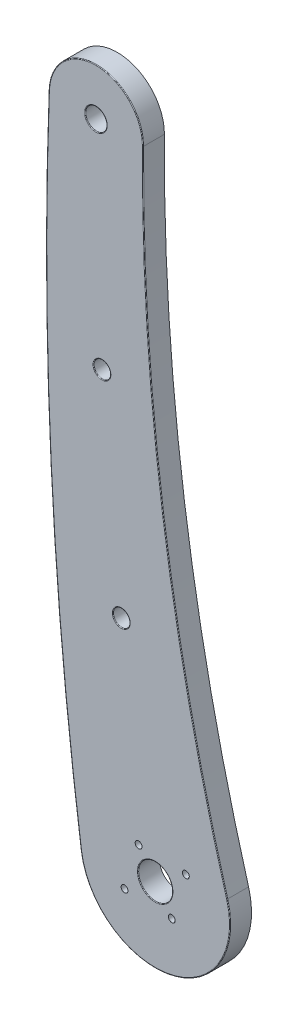
ISO-10303-21;
HEADER;
FILE_DESCRIPTION(('STEP AP214'),'2;1');
FILE_NAME('part.step','',(''),(''),'','','');
FILE_SCHEMA(('AUTOMOTIVE_DESIGN { 1 0 10303 214 1 1 1 1 }'));
ENDSEC;
DATA;
#1=APPLICATION_CONTEXT('core data for automotive mechanical design processes');
#2=APPLICATION_PROTOCOL_DEFINITION('international standard','automotive_design',2000,#1);
#3=PRODUCT_CONTEXT('',#1,'mechanical');
#4=PRODUCT('Part','Part','',(#3));
#5=PRODUCT_RELATED_PRODUCT_CATEGORY('part','',(#4));
#6=PRODUCT_DEFINITION_FORMATION('','',#4);
#7=PRODUCT_DEFINITION_CONTEXT('part definition',#1,'design');
#8=PRODUCT_DEFINITION('design','',#6,#7);
#9=PRODUCT_DEFINITION_SHAPE('','',#8);
#10=(LENGTH_UNIT() NAMED_UNIT(*) SI_UNIT(.MILLI.,.METRE.));
#11=(NAMED_UNIT(*) PLANE_ANGLE_UNIT() SI_UNIT($,.RADIAN.));
#12=(NAMED_UNIT(*) SI_UNIT($,.STERADIAN.) SOLID_ANGLE_UNIT());
#13=UNCERTAINTY_MEASURE_WITH_UNIT(LENGTH_MEASURE(1.E-05),#10,'distance_accuracy_value','');
#14=(GEOMETRIC_REPRESENTATION_CONTEXT(3) GLOBAL_UNCERTAINTY_ASSIGNED_CONTEXT((#13)) GLOBAL_UNIT_ASSIGNED_CONTEXT((#10,
#11,#12)) REPRESENTATION_CONTEXT('',''));
#15=CARTESIAN_POINT('',(0.,0.,0.));
#16=DIRECTION('',(0.,0.,1.));
#17=DIRECTION('',(1.,0.,0.));
#18=AXIS2_PLACEMENT_3D('',#15,#16,#17);
#19=CARTESIAN_POINT('',(-34.070033869126,204.93052277418,-5.));
#20=DIRECTION('',(0.,0.,1.));
#21=DIRECTION('',(1.,0.,0.));
#22=AXIS2_PLACEMENT_3D('',#19,#20,#21);
#23=CYLINDRICAL_SURFACE('',#22,11.0000000000001);
#24=DIRECTION('',(0.,0.,1.));
#25=VECTOR('',#24,1.);
#26=CARTESIAN_POINT('',(-45.0618330985259,205.355198768986,-5.));
#27=LINE('',#26,#25);
#28=CARTESIAN_POINT('',(-45.0618330985259,205.355198768986,-5.));
#29=VERTEX_POINT('',#28);
#30=CARTESIAN_POINT('',(-45.0618330985259,205.355198768986,-0.15));
#31=VERTEX_POINT('',#30);
#32=EDGE_CURVE('E87',#29,#31,#27,.T.);
#33=ORIENTED_EDGE('',*,*,#32,.T.);
#34=CARTESIAN_POINT('',(-34.070033869126,204.93052277418,-0.15));
#35=DIRECTION('',(0.,0.,-1.));
#36=DIRECTION('',(-1.,0.,0.));
#37=AXIS2_PLACEMENT_3D('',#34,#35,#36);
#38=CIRCLE('',#37,11.0000000000001);
#39=CARTESIAN_POINT('',(-23.0703086252271,204.852776013868,-0.15));
#40=VERTEX_POINT('',#39);
#41=EDGE_CURVE('E148',#31,#40,#38,.T.);
#42=ORIENTED_EDGE('',*,*,#41,.T.);
#43=DIRECTION('',(0.,0.,1.));
#44=VECTOR('',#43,1.);
#45=CARTESIAN_POINT('',(-23.0703086252271,204.852776013868,-5.));
#46=LINE('',#45,#44);
#47=CARTESIAN_POINT('',(-23.0703086252271,204.852776013868,-5.));
#48=VERTEX_POINT('',#47);
#49=EDGE_CURVE('E108',#48,#40,#46,.T.);
#50=ORIENTED_EDGE('',*,*,#49,.F.);
#51=CARTESIAN_POINT('',(-34.070033869126,204.93052277418,-5.));
#52=DIRECTION('',(0.,0.,1.));
#53=DIRECTION('',(-1.,0.,0.));
#54=AXIS2_PLACEMENT_3D('',#51,#52,#53);
#55=CIRCLE('',#54,11.0000000000001);
#56=EDGE_CURVE('E102',#48,#29,#55,.T.);
#57=ORIENTED_EDGE('',*,*,#56,.T.);
#58=EDGE_LOOP('',(#33,#42,#50,#57));
#59=FACE_BOUND('',#58,.T.);
#60=ADVANCED_FACE('F33',(#59),#23,.T.);
#61=CARTESIAN_POINT('',(476.917202461075,201.31883236334,-5.));
#62=DIRECTION('',(0.,0.,1.));
#63=DIRECTION('',(1.,0.,0.));
#64=AXIS2_PLACEMENT_3D('',#61,#62,#63);
#65=CYLINDRICAL_SURFACE('',#64,500.);
#66=ORIENTED_EDGE('',*,*,#49,.T.);
#67=CARTESIAN_POINT('',(476.917202461075,201.31883236334,-0.15));
#68=DIRECTION('',(0.,0.,-1.));
#69=DIRECTION('',(-1.,0.,0.));
#70=AXIS2_PLACEMENT_3D('',#67,#68,#69);
#71=CIRCLE('',#70,500.);
#72=CARTESIAN_POINT('',(-3.40859701822455,62.4407334615624,-0.15));
#73=VERTEX_POINT('',#72);
#74=EDGE_CURVE('E143',#40,#73,#71,.F.);
#75=ORIENTED_EDGE('',*,*,#74,.T.);
#76=DIRECTION('',(0.,0.,1.));
#77=VECTOR('',#76,1.);
#78=CARTESIAN_POINT('',(-3.40859701822455,62.4407334615624,-5.));
#79=LINE('',#78,#77);
#80=CARTESIAN_POINT('',(-3.40859701822455,62.4407334615624,-5.));
#81=VERTEX_POINT('',#80);
#82=EDGE_CURVE('E120',#81,#73,#79,.T.);
#83=ORIENTED_EDGE('',*,*,#82,.F.);
#84=CARTESIAN_POINT('',(476.917202461075,201.31883236334,-5.));
#85=DIRECTION('',(0.,0.,-1.));
#86=DIRECTION('',(1.,0.,0.));
#87=AXIS2_PLACEMENT_3D('',#84,#85,#86);
#88=CIRCLE('',#87,500.);
#89=EDGE_CURVE('E95',#81,#48,#88,.T.);
#90=ORIENTED_EDGE('',*,*,#89,.T.);
#91=EDGE_LOOP('',(#66,#75,#83,#90));
#92=FACE_BOUND('',#91,.T.);
#93=ADVANCED_FACE('F204',(#92),#65,.F.);
#94=CARTESIAN_POINT('',(-20.2200000000003,57.58,-5.));
#95=DIRECTION('',(0.,0.,1.));
#96=DIRECTION('',(1.,0.,0.));
#97=AXIS2_PLACEMENT_3D('',#94,#95,#96);
#98=CYLINDRICAL_SURFACE('',#97,17.5);
#99=ORIENTED_EDGE('',*,*,#82,.T.);
#100=CARTESIAN_POINT('',(-20.2200000000003,57.58,-0.15));
#101=DIRECTION('',(0.,0.,-1.));
#102=DIRECTION('',(-1.,0.,0.));
#103=AXIS2_PLACEMENT_3D('',#100,#101,#102);
#104=CIRCLE('',#103,17.5);
#105=CARTESIAN_POINT('',(-37.552346237058,55.1634375822777,-0.15));
#106=VERTEX_POINT('',#105);
#107=EDGE_CURVE('E58',#73,#106,#104,.T.);
#108=ORIENTED_EDGE('',*,*,#107,.T.);
#109=DIRECTION('',(0.,0.,1.));
#110=VECTOR('',#109,1.);
#111=CARTESIAN_POINT('',(-37.552346237058,55.1634375822777,-5.));
#112=LINE('',#111,#110);
#113=CARTESIAN_POINT('',(-37.552346237058,55.1634375822777,-5.));
#114=VERTEX_POINT('',#113);
#115=EDGE_CURVE('E94',#114,#106,#112,.T.);
#116=ORIENTED_EDGE('',*,*,#115,.F.);
#117=CARTESIAN_POINT('',(-20.2200000000003,57.58,-5.));
#118=DIRECTION('',(0.,0.,1.));
#119=DIRECTION('',(-1.,0.,0.));
#120=AXIS2_PLACEMENT_3D('',#117,#118,#119);
#121=CIRCLE('',#120,17.5);
#122=EDGE_CURVE('E105',#114,#81,#121,.T.);
#123=ORIENTED_EDGE('',*,*,#122,.T.);
#124=EDGE_LOOP('',(#99,#108,#116,#123));
#125=FACE_BOUND('',#124,.T.);
#126=ADVANCED_FACE('F209',(#125),#98,.T.);
#127=CARTESIAN_POINT('',(804.304470991464,172.539326443077,-5.));
#128=DIRECTION('',(0.,0.,1.));
#129=DIRECTION('',(1.,0.,0.));
#130=AXIS2_PLACEMENT_3D('',#127,#128,#129);
#131=CYLINDRICAL_SURFACE('',#130,850.);
#132=ORIENTED_EDGE('',*,*,#115,.T.);
#133=CARTESIAN_POINT('',(804.304470991464,172.539326443077,-0.15));
#134=DIRECTION('',(0.,0.,-1.));
#135=DIRECTION('',(-1.,0.,0.));
#136=AXIS2_PLACEMENT_3D('',#133,#134,#135);
#137=CIRCLE('',#136,850.);
#138=EDGE_CURVE('E50',#106,#31,#137,.T.);
#139=ORIENTED_EDGE('',*,*,#138,.T.);
#140=ORIENTED_EDGE('',*,*,#32,.F.);
#141=CARTESIAN_POINT('',(804.304470991464,172.539326443077,-5.));
#142=DIRECTION('',(0.,0.,1.));
#143=DIRECTION('',(1.,0.,0.));
#144=AXIS2_PLACEMENT_3D('',#141,#142,#143);
#145=CIRCLE('',#144,850.);
#146=EDGE_CURVE('E90',#29,#114,#145,.T.);
#147=ORIENTED_EDGE('',*,*,#146,.T.);
#148=EDGE_LOOP('',(#132,#139,#140,#147));
#149=FACE_BOUND('',#148,.T.);
#150=ADVANCED_FACE('F89',(#149),#131,.T.);
#151=CARTESIAN_POINT('',(221.423584295974,203.12467756876,-5.));
#152=DIRECTION('',(0.,0.,-1.));
#153=DIRECTION('',(-1.,0.,0.));
#154=AXIS2_PLACEMENT_3D('',#151,#152,#153);
#155=PLANE('',#154);
#156=CARTESIAN_POINT('',(-24.0961215210223,63.1061362591118,-5.));
#157=DIRECTION('',(0.,0.,1.));
#158=DIRECTION('',(1.,0.,0.));
#159=AXIS2_PLACEMENT_3D('',#156,#157,#158);
#160=CIRCLE('',#159,0.799999999999994);
#161=CARTESIAN_POINT('',(-23.2961215210223,63.1061362591118,-5.));
#162=VERTEX_POINT('',#161);
#163=EDGE_CURVE('E303',#162,#162,#160,.T.);
#164=ORIENTED_EDGE('',*,*,#163,.T.);
#165=EDGE_LOOP('',(#164));
#166=FACE_BOUND('',#165,.T.);
#167=CARTESIAN_POINT('',(-13.056490034485,62.6046019716953,-5.));
#168=DIRECTION('',(0.,0.,1.));
#169=DIRECTION('',(1.,0.,0.));
#170=AXIS2_PLACEMENT_3D('',#167,#168,#169);
#171=CIRCLE('',#170,0.800000000000004);
#172=CARTESIAN_POINT('',(-12.256490034485,62.6046019716953,-5.));
#173=VERTEX_POINT('',#172);
#174=EDGE_CURVE('E311',#173,#173,#171,.T.);
#175=ORIENTED_EDGE('',*,*,#174,.T.);
#176=EDGE_LOOP('',(#175));
#177=FACE_BOUND('',#176,.T.);
#178=CARTESIAN_POINT('',(-16.3438784789781,52.0538637408883,-5.));
#179=DIRECTION('',(0.,0.,1.));
#180=DIRECTION('',(1.,0.,0.));
#181=AXIS2_PLACEMENT_3D('',#178,#179,#180);
#182=CIRCLE('',#181,0.800000000000005);
#183=CARTESIAN_POINT('',(-15.5438784789781,52.0538637408883,-5.));
#184=VERTEX_POINT('',#183);
#185=EDGE_CURVE('E317',#184,#184,#182,.T.);
#186=ORIENTED_EDGE('',*,*,#185,.T.);
#187=EDGE_LOOP('',(#186));
#188=FACE_BOUND('',#187,.T.);
#189=CARTESIAN_POINT('',(-27.3835099655154,52.5553980283048,-5.));
#190=DIRECTION('',(0.,0.,1.));
#191=DIRECTION('',(1.,0.,0.));
#192=AXIS2_PLACEMENT_3D('',#189,#190,#191);
#193=CIRCLE('',#192,0.8);
#194=CARTESIAN_POINT('',(-26.5835099655154,52.5553980283048,-5.));
#195=VERTEX_POINT('',#194);
#196=EDGE_CURVE('E161',#195,#195,#193,.T.);
#197=ORIENTED_EDGE('',*,*,#196,.T.);
#198=EDGE_LOOP('',(#197));
#199=FACE_BOUND('',#198,.T.);
#200=CARTESIAN_POINT('',(-32.6586969077332,154.950445463501,-5.));
#201=DIRECTION('',(0.,0.,-1.));
#202=DIRECTION('',(-1.,0.,0.));
#203=AXIS2_PLACEMENT_3D('',#200,#201,#202);
#204=CIRCLE('',#203,1.94999999999999);
#205=CARTESIAN_POINT('',(-34.6086969077332,154.950445463501,-5.));
#206=VERTEX_POINT('',#205);
#207=EDGE_CURVE('E168',#206,#206,#204,.T.);
#208=ORIENTED_EDGE('',*,*,#207,.F.);
#209=EDGE_LOOP('',(#208));
#210=FACE_BOUND('',#209,.T.);
#211=CARTESIAN_POINT('',(-28.1467342258711,106.947670438379,-5.));
#212=DIRECTION('',(0.,0.,-1.));
#213=DIRECTION('',(-1.,0.,0.));
#214=AXIS2_PLACEMENT_3D('',#211,#212,#213);
#215=CIRCLE('',#214,1.94999999999999);
#216=CARTESIAN_POINT('',(-30.0967342258711,106.947670438379,-5.));
#217=VERTEX_POINT('',#216);
#218=EDGE_CURVE('E173',#217,#217,#215,.T.);
#219=ORIENTED_EDGE('',*,*,#218,.F.);
#220=EDGE_LOOP('',(#219));
#221=FACE_BOUND('',#220,.T.);
#222=CARTESIAN_POINT('',(-20.22,57.58,-5.));
#223=DIRECTION('',(0.,0.,1.));
#224=DIRECTION('',(1.,0.,0.));
#225=AXIS2_PLACEMENT_3D('',#222,#223,#224);
#226=CIRCLE('',#225,4.);
#227=CARTESIAN_POINT('',(-16.22,57.58,-5.));
#228=VERTEX_POINT('',#227);
#229=EDGE_CURVE('E112',#228,#228,#226,.T.);
#230=ORIENTED_EDGE('',*,*,#229,.T.);
#231=EDGE_LOOP('',(#230));
#232=FACE_BOUND('',#231,.T.);
#233=CARTESIAN_POINT('',(-34.0700338691259,204.93052277418,-5.));
#234=DIRECTION('',(0.,0.,1.));
#235=DIRECTION('',(1.,0.,0.));
#236=AXIS2_PLACEMENT_3D('',#233,#234,#235);
#237=CIRCLE('',#236,2.5);
#238=CARTESIAN_POINT('',(-31.5700338691259,204.93052277418,-5.));
#239=VERTEX_POINT('',#238);
#240=EDGE_CURVE('E109',#239,#239,#237,.T.);
#241=ORIENTED_EDGE('',*,*,#240,.T.);
#242=EDGE_LOOP('',(#241));
#243=FACE_BOUND('',#242,.T.);
#244=ORIENTED_EDGE('',*,*,#56,.F.);
#245=ORIENTED_EDGE('',*,*,#89,.F.);
#246=ORIENTED_EDGE('',*,*,#122,.F.);
#247=ORIENTED_EDGE('',*,*,#146,.F.);
#248=EDGE_LOOP('',(#244,#245,#246,#247));
#249=FACE_BOUND('',#248,.T.);
#250=ADVANCED_FACE('F100',(#166,#177,#188,#199,#210,#221,#232,#243,#249),#155,.T.);
#251=CARTESIAN_POINT('',(221.423584295974,203.12467756876,0.));
#252=DIRECTION('',(0.,0.,-1.));
#253=DIRECTION('',(-1.,0.,0.));
#254=AXIS2_PLACEMENT_3D('',#251,#252,#253);
#255=PLANE('',#254);
#256=CARTESIAN_POINT('',(-24.0961215210223,63.1061362591118,0.));
#257=DIRECTION('',(0.,0.,1.));
#258=DIRECTION('',(1.,0.,0.));
#259=AXIS2_PLACEMENT_3D('',#256,#257,#258);
#260=CIRCLE('',#259,0.799999999999994);
#261=CARTESIAN_POINT('',(-23.2961215210223,63.1061362591118,0.));
#262=VERTEX_POINT('',#261);
#263=EDGE_CURVE('E306',#262,#262,#260,.T.);
#264=ORIENTED_EDGE('',*,*,#263,.F.);
#265=EDGE_LOOP('',(#264));
#266=FACE_BOUND('',#265,.T.);
#267=CARTESIAN_POINT('',(-13.056490034485,62.6046019716953,0.));
#268=DIRECTION('',(0.,0.,1.));
#269=DIRECTION('',(1.,0.,0.));
#270=AXIS2_PLACEMENT_3D('',#267,#268,#269);
#271=CIRCLE('',#270,0.800000000000004);
#272=CARTESIAN_POINT('',(-12.256490034485,62.6046019716953,0.));
#273=VERTEX_POINT('',#272);
#274=EDGE_CURVE('E308',#273,#273,#271,.T.);
#275=ORIENTED_EDGE('',*,*,#274,.F.);
#276=EDGE_LOOP('',(#275));
#277=FACE_BOUND('',#276,.T.);
#278=CARTESIAN_POINT('',(-16.3438784789781,52.0538637408883,0.));
#279=DIRECTION('',(0.,0.,1.));
#280=DIRECTION('',(1.,0.,0.));
#281=AXIS2_PLACEMENT_3D('',#278,#279,#280);
#282=CIRCLE('',#281,0.800000000000005);
#283=CARTESIAN_POINT('',(-15.5438784789781,52.0538637408883,0.));
#284=VERTEX_POINT('',#283);
#285=EDGE_CURVE('E314',#284,#284,#282,.T.);
#286=ORIENTED_EDGE('',*,*,#285,.F.);
#287=EDGE_LOOP('',(#286));
#288=FACE_BOUND('',#287,.T.);
#289=CARTESIAN_POINT('',(-27.3835099655154,52.5553980283048,0.));
#290=DIRECTION('',(0.,0.,1.));
#291=DIRECTION('',(1.,0.,0.));
#292=AXIS2_PLACEMENT_3D('',#289,#290,#291);
#293=CIRCLE('',#292,0.8);
#294=CARTESIAN_POINT('',(-26.5835099655154,52.5553980283048,0.));
#295=VERTEX_POINT('',#294);
#296=EDGE_CURVE('E180',#295,#295,#293,.T.);
#297=ORIENTED_EDGE('',*,*,#296,.F.);
#298=EDGE_LOOP('',(#297));
#299=FACE_BOUND('',#298,.T.);
#300=CARTESIAN_POINT('',(-20.2200000000003,57.58,0.));
#301=DIRECTION('',(0.,0.,-1.));
#302=DIRECTION('',(-1.,0.,0.));
#303=AXIS2_PLACEMENT_3D('',#300,#301,#302);
#304=CIRCLE('',#303,17.35);
#305=CARTESIAN_POINT('',(-37.4037832693116,55.1841509744296,0.));
#306=VERTEX_POINT('',#305);
#307=CARTESIAN_POINT('',(-3.55269475806867,62.3990700318918,0.));
#308=VERTEX_POINT('',#307);
#309=EDGE_CURVE('E138',#306,#308,#304,.F.);
#310=ORIENTED_EDGE('',*,*,#309,.T.);
#311=CARTESIAN_POINT('',(476.917202461075,201.31883236334,0.));
#312=DIRECTION('',(0.,0.,-1.));
#313=DIRECTION('',(-1.,0.,0.));
#314=AXIS2_PLACEMENT_3D('',#311,#312,#313);
#315=CIRCLE('',#314,500.15);
#316=CARTESIAN_POINT('',(-23.2203048785531,204.853836196963,0.));
#317=VERTEX_POINT('',#316);
#318=EDGE_CURVE('E140',#308,#317,#315,.T.);
#319=ORIENTED_EDGE('',*,*,#318,.T.);
#320=CARTESIAN_POINT('',(-34.070033869126,204.93052277418,0.));
#321=DIRECTION('',(0.,0.,-1.));
#322=DIRECTION('',(-1.,0.,0.));
#323=AXIS2_PLACEMENT_3D('',#320,#321,#322);
#324=CIRCLE('',#323,10.8500000000001);
#325=CARTESIAN_POINT('',(-44.9119449272159,205.349407732693,0.));
#326=VERTEX_POINT('',#325);
#327=EDGE_CURVE('E134',#317,#326,#324,.F.);
#328=ORIENTED_EDGE('',*,*,#327,.T.);
#329=CARTESIAN_POINT('',(804.304470991464,172.539326443077,0.));
#330=DIRECTION('',(0.,0.,-1.));
#331=DIRECTION('',(-1.,0.,0.));
#332=AXIS2_PLACEMENT_3D('',#329,#330,#331);
#333=CIRCLE('',#332,849.85);
#334=EDGE_CURVE('E136',#326,#306,#333,.F.);
#335=ORIENTED_EDGE('',*,*,#334,.T.);
#336=EDGE_LOOP('',(#310,#319,#328,#335));
#337=FACE_BOUND('',#336,.T.);
#338=CARTESIAN_POINT('',(-34.0700338691259,204.93052277418,0.));
#339=DIRECTION('',(0.,0.,-1.));
#340=DIRECTION('',(-1.,0.,0.));
#341=AXIS2_PLACEMENT_3D('',#338,#339,#340);
#342=CIRCLE('',#341,2.65);
#343=CARTESIAN_POINT('',(-36.7200338691259,204.93052277418,0.));
#344=VERTEX_POINT('',#343);
#345=EDGE_CURVE('E131',#344,#344,#342,.T.);
#346=ORIENTED_EDGE('',*,*,#345,.T.);
#347=EDGE_LOOP('',(#346));
#348=FACE_BOUND('',#347,.T.);
#349=CARTESIAN_POINT('',(-20.22,57.58,0.));
#350=DIRECTION('',(0.,0.,-1.));
#351=DIRECTION('',(-1.,0.,0.));
#352=AXIS2_PLACEMENT_3D('',#349,#350,#351);
#353=CIRCLE('',#352,4.15);
#354=CARTESIAN_POINT('',(-24.37,57.58,0.));
#355=VERTEX_POINT('',#354);
#356=EDGE_CURVE('E128',#355,#355,#353,.T.);
#357=ORIENTED_EDGE('',*,*,#356,.T.);
#358=EDGE_LOOP('',(#357));
#359=FACE_BOUND('',#358,.T.);
#360=CARTESIAN_POINT('',(-28.1467342258711,106.947670438379,0.));
#361=DIRECTION('',(0.,0.,-1.));
#362=DIRECTION('',(-1.,0.,0.));
#363=AXIS2_PLACEMENT_3D('',#360,#361,#362);
#364=CIRCLE('',#363,2.09999999999999);
#365=CARTESIAN_POINT('',(-30.2467342258711,106.947670438379,0.));
#366=VERTEX_POINT('',#365);
#367=EDGE_CURVE('E125',#366,#366,#364,.T.);
#368=ORIENTED_EDGE('',*,*,#367,.T.);
#369=EDGE_LOOP('',(#368));
#370=FACE_BOUND('',#369,.T.);
#371=CARTESIAN_POINT('',(-32.6586969077332,154.950445463501,0.));
#372=DIRECTION('',(0.,0.,-1.));
#373=DIRECTION('',(-1.,0.,0.));
#374=AXIS2_PLACEMENT_3D('',#371,#372,#373);
#375=CIRCLE('',#374,2.09999999999999);
#376=CARTESIAN_POINT('',(-34.7586969077332,154.950445463501,0.));
#377=VERTEX_POINT('',#376);
#378=EDGE_CURVE('E119',#377,#377,#375,.T.);
#379=ORIENTED_EDGE('',*,*,#378,.T.);
#380=EDGE_LOOP('',(#379));
#381=FACE_BOUND('',#380,.T.);
#382=ADVANCED_FACE('F200',(#266,#277,#288,#299,#337,#348,#359,#370,#381),#255,.F.);
#383=CARTESIAN_POINT('',(-34.0700338691259,204.93052277418,-5.));
#384=DIRECTION('',(0.,0.,1.));
#385=DIRECTION('',(1.,0.,0.));
#386=AXIS2_PLACEMENT_3D('',#383,#384,#385);
#387=CYLINDRICAL_SURFACE('',#386,2.5);
#388=CARTESIAN_POINT('',(-34.0700338691259,204.93052277418,-0.15));
#389=DIRECTION('',(0.,0.,-1.));
#390=DIRECTION('',(-1.,0.,0.));
#391=AXIS2_PLACEMENT_3D('',#388,#389,#390);
#392=CIRCLE('',#391,2.5);
#393=CARTESIAN_POINT('',(-36.5700338691259,204.93052277418,-0.15));
#394=VERTEX_POINT('',#393);
#395=EDGE_CURVE('E150',#394,#394,#392,.F.);
#396=ORIENTED_EDGE('',*,*,#395,.T.);
#397=EDGE_LOOP('',(#396));
#398=FACE_BOUND('',#397,.T.);
#399=ORIENTED_EDGE('',*,*,#240,.F.);
#400=EDGE_LOOP('',(#399));
#401=FACE_BOUND('',#400,.T.);
#402=ADVANCED_FACE('F190',(#398,#401),#387,.F.);
#403=CARTESIAN_POINT('',(-20.22,57.58,-5.));
#404=DIRECTION('',(0.,0.,1.));
#405=DIRECTION('',(1.,0.,0.));
#406=AXIS2_PLACEMENT_3D('',#403,#404,#405);
#407=CYLINDRICAL_SURFACE('',#406,4.);
#408=CARTESIAN_POINT('',(-20.22,57.58,-0.15));
#409=DIRECTION('',(0.,0.,-1.));
#410=DIRECTION('',(-1.,0.,0.));
#411=AXIS2_PLACEMENT_3D('',#408,#409,#410);
#412=CIRCLE('',#411,4.);
#413=CARTESIAN_POINT('',(-24.22,57.58,-0.15));
#414=VERTEX_POINT('',#413);
#415=EDGE_CURVE('E153',#414,#414,#412,.F.);
#416=ORIENTED_EDGE('',*,*,#415,.T.);
#417=EDGE_LOOP('',(#416));
#418=FACE_BOUND('',#417,.T.);
#419=ORIENTED_EDGE('',*,*,#229,.F.);
#420=EDGE_LOOP('',(#419));
#421=FACE_BOUND('',#420,.T.);
#422=ADVANCED_FACE('F187',(#418,#421),#407,.F.);
#423=CARTESIAN_POINT('',(-28.1467342258711,106.947670438379,0.));
#424=DIRECTION('',(0.,0.,1.));
#425=DIRECTION('',(1.,0.,0.));
#426=AXIS2_PLACEMENT_3D('',#423,#424,#425);
#427=CYLINDRICAL_SURFACE('',#426,1.94999999999999);
#428=CARTESIAN_POINT('',(-28.1467342258711,106.947670438379,-0.15));
#429=DIRECTION('',(0.,0.,-1.));
#430=DIRECTION('',(-1.,0.,0.));
#431=AXIS2_PLACEMENT_3D('',#428,#429,#430);
#432=CIRCLE('',#431,1.94999999999999);
#433=CARTESIAN_POINT('',(-30.0967342258711,106.947670438379,-0.15));
#434=VERTEX_POINT('',#433);
#435=EDGE_CURVE('E42',#434,#434,#432,.F.);
#436=ORIENTED_EDGE('',*,*,#435,.T.);
#437=EDGE_LOOP('',(#436));
#438=FACE_BOUND('',#437,.T.);
#439=ORIENTED_EDGE('',*,*,#218,.T.);
#440=EDGE_LOOP('',(#439));
#441=FACE_BOUND('',#440,.T.);
#442=ADVANCED_FACE('F189',(#438,#441),#427,.F.);
#443=CARTESIAN_POINT('',(-32.6586969077332,154.950445463501,0.));
#444=DIRECTION('',(0.,0.,1.));
#445=DIRECTION('',(1.,0.,0.));
#446=AXIS2_PLACEMENT_3D('',#443,#444,#445);
#447=CYLINDRICAL_SURFACE('',#446,1.94999999999999);
#448=CARTESIAN_POINT('',(-32.6586969077332,154.950445463501,-0.15));
#449=DIRECTION('',(0.,0.,-1.));
#450=DIRECTION('',(-1.,0.,0.));
#451=AXIS2_PLACEMENT_3D('',#448,#449,#450);
#452=CIRCLE('',#451,1.94999999999999);
#453=CARTESIAN_POINT('',(-34.6086969077332,154.950445463501,-0.15));
#454=VERTEX_POINT('',#453);
#455=EDGE_CURVE('E11',#454,#454,#452,.F.);
#456=ORIENTED_EDGE('',*,*,#455,.T.);
#457=EDGE_LOOP('',(#456));
#458=FACE_BOUND('',#457,.T.);
#459=ORIENTED_EDGE('',*,*,#207,.T.);
#460=EDGE_LOOP('',(#459));
#461=FACE_BOUND('',#460,.T.);
#462=ADVANCED_FACE('F197',(#458,#461),#447,.F.);
#463=CARTESIAN_POINT('',(804.304470991464,172.539326443077,-0.15));
#464=DIRECTION('',(0.,0.,-1.));
#465=DIRECTION('',(-1.,0.,0.));
#466=AXIS2_PLACEMENT_3D('',#463,#464,#465);
#467=TOROIDAL_SURFACE('',#466,849.85,0.15);
#468=CARTESIAN_POINT('',(-44.9119449272158,205.349407732693,-0.15));
#469=DIRECTION('',(0.038606908618713,0.999254475399989,0.));
#470=DIRECTION('',(-0.999254475399989,0.038606908618713,0.));
#471=AXIS2_PLACEMENT_3D('',#468,#469,#470);
#472=CIRCLE('',#471,0.15);
#473=EDGE_CURVE('E162',#31,#326,#472,.T.);
#474=ORIENTED_EDGE('',*,*,#473,.F.);
#475=ORIENTED_EDGE('',*,*,#138,.F.);
#476=CARTESIAN_POINT('',(-37.4037832693116,55.1841509744296,-0.15));
#477=DIRECTION('',(0.138089281012707,-0.990419784974732,0.));
#478=DIRECTION('',(0.990419784974732,0.138089281012707,0.));
#479=AXIS2_PLACEMENT_3D('',#476,#477,#478);
#480=CIRCLE('',#479,0.15);
#481=EDGE_CURVE('E37',#306,#106,#480,.T.);
#482=ORIENTED_EDGE('',*,*,#481,.F.);
#483=ORIENTED_EDGE('',*,*,#334,.F.);
#484=EDGE_LOOP('',(#474,#475,#482,#483));
#485=FACE_BOUND('',#484,.T.);
#486=ADVANCED_FACE('F226',(#485),#467,.T.);
#487=CARTESIAN_POINT('',(-20.2200000000003,57.58,-0.15));
#488=DIRECTION('',(0.,0.,-1.));
#489=DIRECTION('',(-1.,0.,0.));
#490=AXIS2_PLACEMENT_3D('',#487,#488,#489);
#491=TOROIDAL_SURFACE('',#490,17.35,0.15);
#492=ORIENTED_EDGE('',*,*,#481,.T.);
#493=ORIENTED_EDGE('',*,*,#107,.F.);
#494=CARTESIAN_POINT('',(-3.55269475806867,62.3990700318918,-0.15));
#495=DIRECTION('',(-0.277756197803551,0.9606515989586,0.));
#496=DIRECTION('',(-0.9606515989586,-0.277756197803551,0.));
#497=AXIS2_PLACEMENT_3D('',#494,#495,#496);
#498=CIRCLE('',#497,0.15);
#499=EDGE_CURVE('E160',#308,#73,#498,.T.);
#500=ORIENTED_EDGE('',*,*,#499,.F.);
#501=ORIENTED_EDGE('',*,*,#309,.F.);
#502=EDGE_LOOP('',(#492,#493,#500,#501));
#503=FACE_BOUND('',#502,.T.);
#504=ADVANCED_FACE('F223',(#503),#491,.T.);
#505=CARTESIAN_POINT('',(-34.070033869126,204.93052277418,-0.15));
#506=DIRECTION('',(0.,0.,-1.));
#507=DIRECTION('',(-1.,0.,0.));
#508=AXIS2_PLACEMENT_3D('',#505,#506,#507);
#509=TOROIDAL_SURFACE('',#508,10.8500000000001,0.15);
#510=ORIENTED_EDGE('',*,*,#473,.T.);
#511=ORIENTED_EDGE('',*,*,#327,.F.);
#512=CARTESIAN_POINT('',(-23.2203048785531,204.853836196963,-0.15));
#513=DIRECTION('',(-0.00706788730098216,-0.999975022172604,0.));
#514=DIRECTION('',(0.999975022172604,-0.00706788730098216,0.));
#515=AXIS2_PLACEMENT_3D('',#512,#513,#514);
#516=CIRCLE('',#515,0.15);
#517=EDGE_CURVE('E158',#40,#317,#516,.T.);
#518=ORIENTED_EDGE('',*,*,#517,.F.);
#519=ORIENTED_EDGE('',*,*,#41,.F.);
#520=EDGE_LOOP('',(#510,#511,#518,#519));
#521=FACE_BOUND('',#520,.T.);
#522=ADVANCED_FACE('F219',(#521),#509,.T.);
#523=CARTESIAN_POINT('',(476.917202461075,201.31883236334,-0.15));
#524=DIRECTION('',(0.,0.,-1.));
#525=DIRECTION('',(-1.,0.,0.));
#526=AXIS2_PLACEMENT_3D('',#523,#524,#525);
#527=TOROIDAL_SURFACE('',#526,500.15,0.15);
#528=ORIENTED_EDGE('',*,*,#499,.T.);
#529=ORIENTED_EDGE('',*,*,#74,.F.);
#530=ORIENTED_EDGE('',*,*,#517,.T.);
#531=ORIENTED_EDGE('',*,*,#318,.F.);
#532=EDGE_LOOP('',(#528,#529,#530,#531));
#533=FACE_BOUND('',#532,.T.);
#534=ADVANCED_FACE('F215',(#533),#527,.T.);
#535=CARTESIAN_POINT('',(-34.0700338691259,204.93052277418,-0.15));
#536=DIRECTION('',(0.,0.,-1.));
#537=DIRECTION('',(-1.,0.,0.));
#538=AXIS2_PLACEMENT_3D('',#535,#536,#537);
#539=TOROIDAL_SURFACE('',#538,2.65,0.15);
#540=ORIENTED_EDGE('',*,*,#345,.F.);
#541=EDGE_LOOP('',(#540));
#542=FACE_BOUND('',#541,.T.);
#543=ORIENTED_EDGE('',*,*,#395,.F.);
#544=EDGE_LOOP('',(#543));
#545=FACE_BOUND('',#544,.T.);
#546=ADVANCED_FACE('F218',(#542,#545),#539,.T.);
#547=CARTESIAN_POINT('',(-20.22,57.58,-0.15));
#548=DIRECTION('',(0.,0.,-1.));
#549=DIRECTION('',(-1.,0.,0.));
#550=AXIS2_PLACEMENT_3D('',#547,#548,#549);
#551=TOROIDAL_SURFACE('',#550,4.15,0.15);
#552=ORIENTED_EDGE('',*,*,#356,.F.);
#553=EDGE_LOOP('',(#552));
#554=FACE_BOUND('',#553,.T.);
#555=ORIENTED_EDGE('',*,*,#415,.F.);
#556=EDGE_LOOP('',(#555));
#557=FACE_BOUND('',#556,.T.);
#558=ADVANCED_FACE('F232',(#554,#557),#551,.T.);
#559=CARTESIAN_POINT('',(-28.1467342258711,106.947670438379,-0.15));
#560=DIRECTION('',(0.,0.,-1.));
#561=DIRECTION('',(-1.,0.,0.));
#562=AXIS2_PLACEMENT_3D('',#559,#560,#561);
#563=TOROIDAL_SURFACE('',#562,2.09999999999999,0.15);
#564=ORIENTED_EDGE('',*,*,#367,.F.);
#565=EDGE_LOOP('',(#564));
#566=FACE_BOUND('',#565,.T.);
#567=ORIENTED_EDGE('',*,*,#435,.F.);
#568=EDGE_LOOP('',(#567));
#569=FACE_BOUND('',#568,.T.);
#570=ADVANCED_FACE('F235',(#566,#569),#563,.T.);
#571=CARTESIAN_POINT('',(-32.6586969077332,154.950445463501,-0.15));
#572=DIRECTION('',(0.,0.,-1.));
#573=DIRECTION('',(-1.,0.,0.));
#574=AXIS2_PLACEMENT_3D('',#571,#572,#573);
#575=TOROIDAL_SURFACE('',#574,2.09999999999999,0.15);
#576=ORIENTED_EDGE('',*,*,#378,.F.);
#577=EDGE_LOOP('',(#576));
#578=FACE_BOUND('',#577,.T.);
#579=ORIENTED_EDGE('',*,*,#455,.F.);
#580=EDGE_LOOP('',(#579));
#581=FACE_BOUND('',#580,.T.);
#582=ADVANCED_FACE('F35',(#578,#581),#575,.T.);
#583=CARTESIAN_POINT('',(-27.3835099655154,52.5553980283048,-5.));
#584=DIRECTION('',(0.,0.,1.));
#585=DIRECTION('',(1.,0.,0.));
#586=AXIS2_PLACEMENT_3D('',#583,#584,#585);
#587=CYLINDRICAL_SURFACE('',#586,0.8);
#588=ORIENTED_EDGE('',*,*,#196,.F.);
#589=EDGE_LOOP('',(#588));
#590=FACE_BOUND('',#589,.T.);
#591=ORIENTED_EDGE('',*,*,#296,.T.);
#592=EDGE_LOOP('',(#591));
#593=FACE_BOUND('',#592,.T.);
#594=ADVANCED_FACE('F242',(#590,#593),#587,.F.);
#595=CARTESIAN_POINT('',(-16.3438784789781,52.0538637408883,-5.));
#596=DIRECTION('',(0.,0.,1.));
#597=DIRECTION('',(1.,0.,0.));
#598=AXIS2_PLACEMENT_3D('',#595,#596,#597);
#599=CYLINDRICAL_SURFACE('',#598,0.800000000000005);
#600=ORIENTED_EDGE('',*,*,#185,.F.);
#601=EDGE_LOOP('',(#600));
#602=FACE_BOUND('',#601,.T.);
#603=ORIENTED_EDGE('',*,*,#285,.T.);
#604=EDGE_LOOP('',(#603));
#605=FACE_BOUND('',#604,.T.);
#606=ADVANCED_FACE('F287',(#602,#605),#599,.F.);
#607=CARTESIAN_POINT('',(-13.056490034485,62.6046019716953,-5.));
#608=DIRECTION('',(0.,0.,1.));
#609=DIRECTION('',(1.,0.,0.));
#610=AXIS2_PLACEMENT_3D('',#607,#608,#609);
#611=CYLINDRICAL_SURFACE('',#610,0.800000000000004);
#612=ORIENTED_EDGE('',*,*,#174,.F.);
#613=EDGE_LOOP('',(#612));
#614=FACE_BOUND('',#613,.T.);
#615=ORIENTED_EDGE('',*,*,#274,.T.);
#616=EDGE_LOOP('',(#615));
#617=FACE_BOUND('',#616,.T.);
#618=ADVANCED_FACE('F291',(#614,#617),#611,.F.);
#619=CARTESIAN_POINT('',(-24.0961215210223,63.1061362591118,-5.));
#620=DIRECTION('',(0.,0.,1.));
#621=DIRECTION('',(1.,0.,0.));
#622=AXIS2_PLACEMENT_3D('',#619,#620,#621);
#623=CYLINDRICAL_SURFACE('',#622,0.799999999999994);
#624=ORIENTED_EDGE('',*,*,#163,.F.);
#625=EDGE_LOOP('',(#624));
#626=FACE_BOUND('',#625,.T.);
#627=ORIENTED_EDGE('',*,*,#263,.T.);
#628=EDGE_LOOP('',(#627));
#629=FACE_BOUND('',#628,.T.);
#630=ADVANCED_FACE('F295',(#626,#629),#623,.F.);
#631=CLOSED_SHELL('',(#60,#93,#126,#150,#250,#382,#402,#422,#442,#462,#486,#504,#522,#534,#546,
#558,#570,#582,#594,#606,#618,#630));
#632=MANIFOLD_SOLID_BREP('B2',#631);
#633=ADVANCED_BREP_SHAPE_REPRESENTATION('',(#18,#632),#14);
#634=SHAPE_DEFINITION_REPRESENTATION(#9,#633);
ENDSEC;
END-ISO-10303-21;
